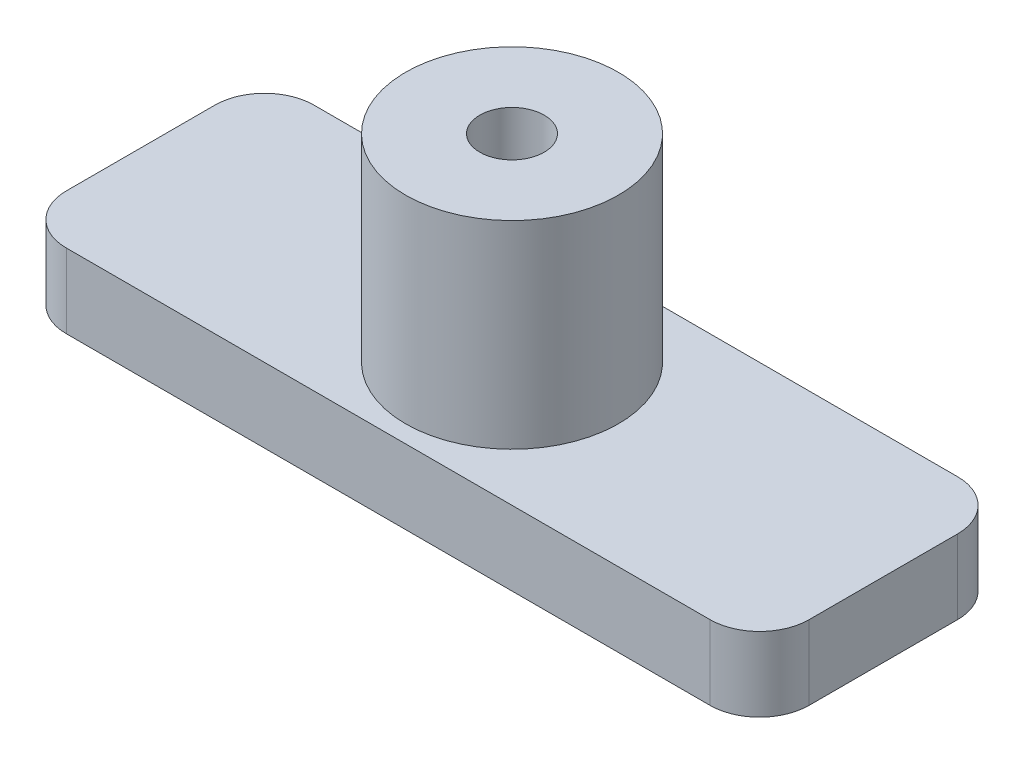
ISO-10303-21;
HEADER;
FILE_DESCRIPTION(('STEP AP214'),'2;1');
FILE_NAME('part.step','',(''),(''),'','','');
FILE_SCHEMA(('AUTOMOTIVE_DESIGN { 1 0 10303 214 1 1 1 1 }'));
ENDSEC;
DATA;
#1=APPLICATION_CONTEXT('core data for automotive mechanical design processes');
#2=APPLICATION_PROTOCOL_DEFINITION('international standard','automotive_design',2000,#1);
#3=PRODUCT_CONTEXT('',#1,'mechanical');
#4=PRODUCT('Part','Part','',(#3));
#5=PRODUCT_RELATED_PRODUCT_CATEGORY('part','',(#4));
#6=PRODUCT_DEFINITION_FORMATION('','',#4);
#7=PRODUCT_DEFINITION_CONTEXT('part definition',#1,'design');
#8=PRODUCT_DEFINITION('design','',#6,#7);
#9=PRODUCT_DEFINITION_SHAPE('','',#8);
#10=(LENGTH_UNIT() NAMED_UNIT(*) SI_UNIT(.MILLI.,.METRE.));
#11=(NAMED_UNIT(*) PLANE_ANGLE_UNIT() SI_UNIT($,.RADIAN.));
#12=(NAMED_UNIT(*) SI_UNIT($,.STERADIAN.) SOLID_ANGLE_UNIT());
#13=UNCERTAINTY_MEASURE_WITH_UNIT(LENGTH_MEASURE(1.E-05),#10,'distance_accuracy_value','');
#14=(GEOMETRIC_REPRESENTATION_CONTEXT(3) GLOBAL_UNCERTAINTY_ASSIGNED_CONTEXT((#13)) GLOBAL_UNIT_ASSIGNED_CONTEXT((#10,
#11,#12)) REPRESENTATION_CONTEXT('',''));
#15=CARTESIAN_POINT('',(0.,0.,0.));
#16=DIRECTION('',(0.,0.,1.));
#17=DIRECTION('',(1.,0.,0.));
#18=AXIS2_PLACEMENT_3D('',#15,#16,#17);
#19=CARTESIAN_POINT('',(-15.,3.,5.));
#20=DIRECTION('',(1.,0.,0.));
#21=DIRECTION('',(0.,0.,-1.));
#22=AXIS2_PLACEMENT_3D('',#19,#20,#21);
#23=PLANE('',#22);
#24=DIRECTION('',(0.,0.,1.));
#25=VECTOR('',#24,1.);
#26=CARTESIAN_POINT('',(-15.,3.,5.));
#27=LINE('',#26,#25);
#28=CARTESIAN_POINT('',(-15.,3.,-3.));
#29=VERTEX_POINT('',#28);
#30=CARTESIAN_POINT('',(-15.,3.,3.));
#31=VERTEX_POINT('',#30);
#32=EDGE_CURVE('E127',#29,#31,#27,.T.);
#33=ORIENTED_EDGE('',*,*,#32,.F.);
#34=DIRECTION('',(0.,-1.,0.));
#35=VECTOR('',#34,1.);
#36=CARTESIAN_POINT('',(-15.,3.,-3.));
#37=LINE('',#36,#35);
#38=CARTESIAN_POINT('',(-15.,0.,-3.));
#39=VERTEX_POINT('',#38);
#40=EDGE_CURVE('E11',#29,#39,#37,.T.);
#41=ORIENTED_EDGE('',*,*,#40,.T.);
#42=DIRECTION('',(0.,0.,1.));
#43=VECTOR('',#42,1.);
#44=CARTESIAN_POINT('',(-15.,0.,5.));
#45=LINE('',#44,#43);
#46=CARTESIAN_POINT('',(-15.,0.,3.));
#47=VERTEX_POINT('',#46);
#48=EDGE_CURVE('E159',#39,#47,#45,.T.);
#49=ORIENTED_EDGE('',*,*,#48,.T.);
#50=DIRECTION('',(0.,-1.,0.));
#51=VECTOR('',#50,1.);
#52=CARTESIAN_POINT('',(-15.,3.,3.));
#53=LINE('',#52,#51);
#54=EDGE_CURVE('E41',#47,#31,#53,.F.);
#55=ORIENTED_EDGE('',*,*,#54,.T.);
#56=EDGE_LOOP('',(#33,#41,#49,#55));
#57=FACE_BOUND('',#56,.T.);
#58=ADVANCED_FACE('F33',(#57),#23,.F.);
#59=CARTESIAN_POINT('',(15.,3.,5.));
#60=DIRECTION('',(0.,0.,-1.));
#61=DIRECTION('',(-1.,0.,0.));
#62=AXIS2_PLACEMENT_3D('',#59,#60,#61);
#63=PLANE('',#62);
#64=DIRECTION('',(1.,0.,0.));
#65=VECTOR('',#64,1.);
#66=CARTESIAN_POINT('',(15.,0.,5.));
#67=LINE('',#66,#65);
#68=CARTESIAN_POINT('',(-13.,0.,5.));
#69=VERTEX_POINT('',#68);
#70=CARTESIAN_POINT('',(13.,0.,5.));
#71=VERTEX_POINT('',#70);
#72=EDGE_CURVE('E132',#69,#71,#67,.T.);
#73=ORIENTED_EDGE('',*,*,#72,.T.);
#74=DIRECTION('',(0.,-1.,0.));
#75=VECTOR('',#74,1.);
#76=CARTESIAN_POINT('',(13.,3.,5.));
#77=LINE('',#76,#75);
#78=CARTESIAN_POINT('',(13.,3.,5.));
#79=VERTEX_POINT('',#78);
#80=EDGE_CURVE('E48',#71,#79,#77,.F.);
#81=ORIENTED_EDGE('',*,*,#80,.T.);
#82=DIRECTION('',(1.,0.,0.));
#83=VECTOR('',#82,1.);
#84=CARTESIAN_POINT('',(15.,3.,5.));
#85=LINE('',#84,#83);
#86=CARTESIAN_POINT('',(-13.,3.,5.));
#87=VERTEX_POINT('',#86);
#88=EDGE_CURVE('E130',#87,#79,#85,.T.);
#89=ORIENTED_EDGE('',*,*,#88,.F.);
#90=DIRECTION('',(0.,-1.,0.));
#91=VECTOR('',#90,1.);
#92=CARTESIAN_POINT('',(-13.,3.,5.));
#93=LINE('',#92,#91);
#94=EDGE_CURVE('E151',#87,#69,#93,.T.);
#95=ORIENTED_EDGE('',*,*,#94,.T.);
#96=EDGE_LOOP('',(#73,#81,#89,#95));
#97=FACE_BOUND('',#96,.T.);
#98=ADVANCED_FACE('F166',(#97),#63,.F.);
#99=CARTESIAN_POINT('',(15.,3.,5.));
#100=DIRECTION('',(-1.,0.,0.));
#101=DIRECTION('',(0.,0.,1.));
#102=AXIS2_PLACEMENT_3D('',#99,#100,#101);
#103=PLANE('',#102);
#104=DIRECTION('',(0.,0.,-1.));
#105=VECTOR('',#104,1.);
#106=CARTESIAN_POINT('',(15.,0.,5.));
#107=LINE('',#106,#105);
#108=CARTESIAN_POINT('',(15.,0.,3.));
#109=VERTEX_POINT('',#108);
#110=CARTESIAN_POINT('',(15.,0.,-3.));
#111=VERTEX_POINT('',#110);
#112=EDGE_CURVE('E128',#109,#111,#107,.T.);
#113=ORIENTED_EDGE('',*,*,#112,.T.);
#114=DIRECTION('',(0.,-1.,0.));
#115=VECTOR('',#114,1.);
#116=CARTESIAN_POINT('',(15.,3.,-3.));
#117=LINE('',#116,#115);
#118=CARTESIAN_POINT('',(15.,3.,-3.));
#119=VERTEX_POINT('',#118);
#120=EDGE_CURVE('E105',#111,#119,#117,.F.);
#121=ORIENTED_EDGE('',*,*,#120,.T.);
#122=DIRECTION('',(0.,0.,-1.));
#123=VECTOR('',#122,1.);
#124=CARTESIAN_POINT('',(15.,3.,5.));
#125=LINE('',#124,#123);
#126=CARTESIAN_POINT('',(15.,3.,3.));
#127=VERTEX_POINT('',#126);
#128=EDGE_CURVE('E171',#127,#119,#125,.T.);
#129=ORIENTED_EDGE('',*,*,#128,.F.);
#130=DIRECTION('',(0.,-1.,0.));
#131=VECTOR('',#130,1.);
#132=CARTESIAN_POINT('',(15.,3.,3.));
#133=LINE('',#132,#131);
#134=EDGE_CURVE('E110',#127,#109,#133,.T.);
#135=ORIENTED_EDGE('',*,*,#134,.T.);
#136=EDGE_LOOP('',(#113,#121,#129,#135));
#137=FACE_BOUND('',#136,.T.);
#138=ADVANCED_FACE('F206',(#137),#103,.F.);
#139=CARTESIAN_POINT('',(15.,3.,-5.));
#140=DIRECTION('',(0.,0.,1.));
#141=DIRECTION('',(1.,0.,0.));
#142=AXIS2_PLACEMENT_3D('',#139,#140,#141);
#143=PLANE('',#142);
#144=DIRECTION('',(-1.,0.,0.));
#145=VECTOR('',#144,1.);
#146=CARTESIAN_POINT('',(15.,3.,-5.));
#147=LINE('',#146,#145);
#148=CARTESIAN_POINT('',(13.,3.,-5.));
#149=VERTEX_POINT('',#148);
#150=CARTESIAN_POINT('',(-13.,3.,-5.));
#151=VERTEX_POINT('',#150);
#152=EDGE_CURVE('E120',#149,#151,#147,.T.);
#153=ORIENTED_EDGE('',*,*,#152,.F.);
#154=DIRECTION('',(0.,-1.,0.));
#155=VECTOR('',#154,1.);
#156=CARTESIAN_POINT('',(13.,3.,-5.));
#157=LINE('',#156,#155);
#158=CARTESIAN_POINT('',(13.,0.,-5.));
#159=VERTEX_POINT('',#158);
#160=EDGE_CURVE('E104',#149,#159,#157,.T.);
#161=ORIENTED_EDGE('',*,*,#160,.T.);
#162=DIRECTION('',(-1.,0.,0.));
#163=VECTOR('',#162,1.);
#164=CARTESIAN_POINT('',(15.,0.,-5.));
#165=LINE('',#164,#163);
#166=CARTESIAN_POINT('',(-13.,0.,-5.));
#167=VERTEX_POINT('',#166);
#168=EDGE_CURVE('E117',#159,#167,#165,.T.);
#169=ORIENTED_EDGE('',*,*,#168,.T.);
#170=DIRECTION('',(0.,-1.,0.));
#171=VECTOR('',#170,1.);
#172=CARTESIAN_POINT('',(-13.,3.,-5.));
#173=LINE('',#172,#171);
#174=EDGE_CURVE('E122',#167,#151,#173,.F.);
#175=ORIENTED_EDGE('',*,*,#174,.T.);
#176=EDGE_LOOP('',(#153,#161,#169,#175));
#177=FACE_BOUND('',#176,.T.);
#178=ADVANCED_FACE('F116',(#177),#143,.F.);
#179=CARTESIAN_POINT('',(0.,3.,0.));
#180=DIRECTION('',(0.,1.,0.));
#181=DIRECTION('',(0.,0.,1.));
#182=AXIS2_PLACEMENT_3D('',#179,#180,#181);
#183=PLANE('',#182);
#184=CARTESIAN_POINT('',(0.,3.,0.));
#185=DIRECTION('',(0.,1.,0.));
#186=DIRECTION('',(0.,0.,1.));
#187=AXIS2_PLACEMENT_3D('',#184,#185,#186);
#188=CIRCLE('',#187,4.3);
#189=CARTESIAN_POINT('',(0.,3.,4.3));
#190=VERTEX_POINT('',#189);
#191=EDGE_CURVE('E136',#190,#190,#188,.T.);
#192=ORIENTED_EDGE('',*,*,#191,.F.);
#193=EDGE_LOOP('',(#192));
#194=FACE_BOUND('',#193,.T.);
#195=ORIENTED_EDGE('',*,*,#128,.T.);
#196=CARTESIAN_POINT('',(13.,3.,-3.));
#197=DIRECTION('',(0.,1.,0.));
#198=DIRECTION('',(0.,0.,1.));
#199=AXIS2_PLACEMENT_3D('',#196,#197,#198);
#200=CIRCLE('',#199,2.);
#201=EDGE_CURVE('E149',#119,#149,#200,.T.);
#202=ORIENTED_EDGE('',*,*,#201,.T.);
#203=ORIENTED_EDGE('',*,*,#152,.T.);
#204=CARTESIAN_POINT('',(-13.,3.,-3.));
#205=DIRECTION('',(0.,1.,0.));
#206=DIRECTION('',(0.,0.,1.));
#207=AXIS2_PLACEMENT_3D('',#204,#205,#206);
#208=CIRCLE('',#207,2.);
#209=EDGE_CURVE('E145',#151,#29,#208,.T.);
#210=ORIENTED_EDGE('',*,*,#209,.T.);
#211=ORIENTED_EDGE('',*,*,#32,.T.);
#212=CARTESIAN_POINT('',(-13.,3.,3.));
#213=DIRECTION('',(0.,1.,0.));
#214=DIRECTION('',(0.,0.,1.));
#215=AXIS2_PLACEMENT_3D('',#212,#213,#214);
#216=CIRCLE('',#215,2.);
#217=EDGE_CURVE('E55',#31,#87,#216,.T.);
#218=ORIENTED_EDGE('',*,*,#217,.T.);
#219=ORIENTED_EDGE('',*,*,#88,.T.);
#220=CARTESIAN_POINT('',(13.,3.,3.));
#221=DIRECTION('',(0.,1.,0.));
#222=DIRECTION('',(0.,0.,1.));
#223=AXIS2_PLACEMENT_3D('',#220,#221,#222);
#224=CIRCLE('',#223,2.);
#225=EDGE_CURVE('E147',#79,#127,#224,.T.);
#226=ORIENTED_EDGE('',*,*,#225,.T.);
#227=EDGE_LOOP('',(#195,#202,#203,#210,#211,#218,#219,#226));
#228=FACE_BOUND('',#227,.T.);
#229=ADVANCED_FACE('F162',(#194,#228),#183,.T.);
#230=CARTESIAN_POINT('',(0.,0.,0.));
#231=DIRECTION('',(0.,1.,0.));
#232=DIRECTION('',(0.,0.,1.));
#233=AXIS2_PLACEMENT_3D('',#230,#231,#232);
#234=PLANE('',#233);
#235=ORIENTED_EDGE('',*,*,#168,.F.);
#236=CARTESIAN_POINT('',(13.,0.,-3.));
#237=DIRECTION('',(0.,1.,0.));
#238=DIRECTION('',(0.,0.,1.));
#239=AXIS2_PLACEMENT_3D('',#236,#237,#238);
#240=CIRCLE('',#239,2.);
#241=EDGE_CURVE('E100',#159,#111,#240,.F.);
#242=ORIENTED_EDGE('',*,*,#241,.T.);
#243=ORIENTED_EDGE('',*,*,#112,.F.);
#244=CARTESIAN_POINT('',(13.,0.,3.));
#245=DIRECTION('',(0.,1.,0.));
#246=DIRECTION('',(0.,0.,1.));
#247=AXIS2_PLACEMENT_3D('',#244,#245,#246);
#248=CIRCLE('',#247,2.);
#249=EDGE_CURVE('E111',#109,#71,#248,.F.);
#250=ORIENTED_EDGE('',*,*,#249,.T.);
#251=ORIENTED_EDGE('',*,*,#72,.F.);
#252=CARTESIAN_POINT('',(-13.,0.,3.));
#253=DIRECTION('',(0.,1.,0.));
#254=DIRECTION('',(0.,0.,1.));
#255=AXIS2_PLACEMENT_3D('',#252,#253,#254);
#256=CIRCLE('',#255,2.);
#257=EDGE_CURVE('E121',#69,#47,#256,.F.);
#258=ORIENTED_EDGE('',*,*,#257,.T.);
#259=ORIENTED_EDGE('',*,*,#48,.F.);
#260=CARTESIAN_POINT('',(-13.,0.,-3.));
#261=DIRECTION('',(0.,1.,0.));
#262=DIRECTION('',(0.,0.,1.));
#263=AXIS2_PLACEMENT_3D('',#260,#261,#262);
#264=CIRCLE('',#263,2.);
#265=EDGE_CURVE('E126',#39,#167,#264,.F.);
#266=ORIENTED_EDGE('',*,*,#265,.T.);
#267=EDGE_LOOP('',(#235,#242,#243,#250,#251,#258,#259,#266));
#268=FACE_BOUND('',#267,.T.);
#269=ADVANCED_FACE('F124',(#268),#234,.F.);
#270=CARTESIAN_POINT('',(0.,11.,0.));
#271=DIRECTION('',(0.,1.,0.));
#272=DIRECTION('',(0.,0.,1.));
#273=AXIS2_PLACEMENT_3D('',#270,#271,#272);
#274=PLANE('',#273);
#275=CARTESIAN_POINT('',(0.,11.,0.));
#276=DIRECTION('',(0.,1.,0.));
#277=DIRECTION('',(0.,0.,1.));
#278=AXIS2_PLACEMENT_3D('',#275,#276,#277);
#279=CIRCLE('',#278,4.3);
#280=CARTESIAN_POINT('',(0.,11.,4.3));
#281=VERTEX_POINT('',#280);
#282=EDGE_CURVE('E167',#281,#281,#279,.T.);
#283=ORIENTED_EDGE('',*,*,#282,.T.);
#284=EDGE_LOOP('',(#283));
#285=FACE_BOUND('',#284,.T.);
#286=CARTESIAN_POINT('',(0.,11.,0.));
#287=DIRECTION('',(0.,1.,0.));
#288=DIRECTION('',(0.,0.,1.));
#289=AXIS2_PLACEMENT_3D('',#286,#287,#288);
#290=CIRCLE('',#289,1.3);
#291=CARTESIAN_POINT('',(0.,11.,1.3));
#292=VERTEX_POINT('',#291);
#293=EDGE_CURVE('E178',#292,#292,#290,.T.);
#294=ORIENTED_EDGE('',*,*,#293,.F.);
#295=EDGE_LOOP('',(#294));
#296=FACE_BOUND('',#295,.T.);
#297=ADVANCED_FACE('F188',(#285,#296),#274,.T.);
#298=CARTESIAN_POINT('',(0.,11.,0.));
#299=DIRECTION('',(0.,-1.,0.));
#300=DIRECTION('',(0.,0.,-1.));
#301=AXIS2_PLACEMENT_3D('',#298,#299,#300);
#302=CYLINDRICAL_SURFACE('',#301,4.3);
#303=ORIENTED_EDGE('',*,*,#282,.F.);
#304=EDGE_LOOP('',(#303));
#305=FACE_BOUND('',#304,.T.);
#306=ORIENTED_EDGE('',*,*,#191,.T.);
#307=EDGE_LOOP('',(#306));
#308=FACE_BOUND('',#307,.T.);
#309=ADVANCED_FACE('F190',(#305,#308),#302,.T.);
#310=CARTESIAN_POINT('',(0.,11.,0.));
#311=DIRECTION('',(0.,-1.,0.));
#312=DIRECTION('',(0.,0.,-1.));
#313=AXIS2_PLACEMENT_3D('',#310,#311,#312);
#314=CYLINDRICAL_SURFACE('',#313,1.3);
#315=ORIENTED_EDGE('',*,*,#293,.T.);
#316=EDGE_LOOP('',(#315));
#317=FACE_BOUND('',#316,.T.);
#318=CARTESIAN_POINT('',(0.,3.,0.));
#319=DIRECTION('',(0.,1.,0.));
#320=DIRECTION('',(0.,0.,1.));
#321=AXIS2_PLACEMENT_3D('',#318,#319,#320);
#322=CIRCLE('',#321,1.3);
#323=CARTESIAN_POINT('',(0.,3.,1.3));
#324=VERTEX_POINT('',#323);
#325=EDGE_CURVE('E179',#324,#324,#322,.T.);
#326=ORIENTED_EDGE('',*,*,#325,.F.);
#327=EDGE_LOOP('',(#326));
#328=FACE_BOUND('',#327,.T.);
#329=ADVANCED_FACE('F185',(#317,#328),#314,.F.);
#330=ORIENTED_EDGE('',*,*,#325,.T.);
#331=EDGE_LOOP('',(#330));
#332=FACE_BOUND('',#331,.T.);
#333=ADVANCED_FACE('F213',(#332),#183,.T.);
#334=CARTESIAN_POINT('',(13.,3.,-3.));
#335=DIRECTION('',(0.,-1.,0.));
#336=DIRECTION('',(0.,0.,-1.));
#337=AXIS2_PLACEMENT_3D('',#334,#335,#336);
#338=CYLINDRICAL_SURFACE('',#337,2.);
#339=ORIENTED_EDGE('',*,*,#201,.F.);
#340=ORIENTED_EDGE('',*,*,#120,.F.);
#341=ORIENTED_EDGE('',*,*,#241,.F.);
#342=ORIENTED_EDGE('',*,*,#160,.F.);
#343=EDGE_LOOP('',(#339,#340,#341,#342));
#344=FACE_BOUND('',#343,.T.);
#345=ADVANCED_FACE('F103',(#344),#338,.T.);
#346=CARTESIAN_POINT('',(13.,3.,3.));
#347=DIRECTION('',(0.,-1.,0.));
#348=DIRECTION('',(0.,0.,-1.));
#349=AXIS2_PLACEMENT_3D('',#346,#347,#348);
#350=CYLINDRICAL_SURFACE('',#349,2.);
#351=ORIENTED_EDGE('',*,*,#225,.F.);
#352=ORIENTED_EDGE('',*,*,#80,.F.);
#353=ORIENTED_EDGE('',*,*,#249,.F.);
#354=ORIENTED_EDGE('',*,*,#134,.F.);
#355=EDGE_LOOP('',(#351,#352,#353,#354));
#356=FACE_BOUND('',#355,.T.);
#357=ADVANCED_FACE('F212',(#356),#350,.T.);
#358=CARTESIAN_POINT('',(-13.,3.,-3.));
#359=DIRECTION('',(0.,-1.,0.));
#360=DIRECTION('',(0.,0.,-1.));
#361=AXIS2_PLACEMENT_3D('',#358,#359,#360);
#362=CYLINDRICAL_SURFACE('',#361,2.);
#363=ORIENTED_EDGE('',*,*,#209,.F.);
#364=ORIENTED_EDGE('',*,*,#174,.F.);
#365=ORIENTED_EDGE('',*,*,#265,.F.);
#366=ORIENTED_EDGE('',*,*,#40,.F.);
#367=EDGE_LOOP('',(#363,#364,#365,#366));
#368=FACE_BOUND('',#367,.T.);
#369=ADVANCED_FACE('F215',(#368),#362,.T.);
#370=CARTESIAN_POINT('',(-13.,3.,3.));
#371=DIRECTION('',(0.,-1.,0.));
#372=DIRECTION('',(0.,0.,-1.));
#373=AXIS2_PLACEMENT_3D('',#370,#371,#372);
#374=CYLINDRICAL_SURFACE('',#373,2.);
#375=ORIENTED_EDGE('',*,*,#217,.F.);
#376=ORIENTED_EDGE('',*,*,#54,.F.);
#377=ORIENTED_EDGE('',*,*,#257,.F.);
#378=ORIENTED_EDGE('',*,*,#94,.F.);
#379=EDGE_LOOP('',(#375,#376,#377,#378));
#380=FACE_BOUND('',#379,.T.);
#381=ADVANCED_FACE('F35',(#380),#374,.T.);
#382=CLOSED_SHELL('',(#58,#98,#138,#178,#229,#269,#297,#309,#329,#333,#345,#357,#369,#381));
#383=MANIFOLD_SOLID_BREP('B2',#382);
#384=ADVANCED_BREP_SHAPE_REPRESENTATION('',(#18,#383),#14);
#385=SHAPE_DEFINITION_REPRESENTATION(#9,#384);
ENDSEC;
END-ISO-10303-21;
